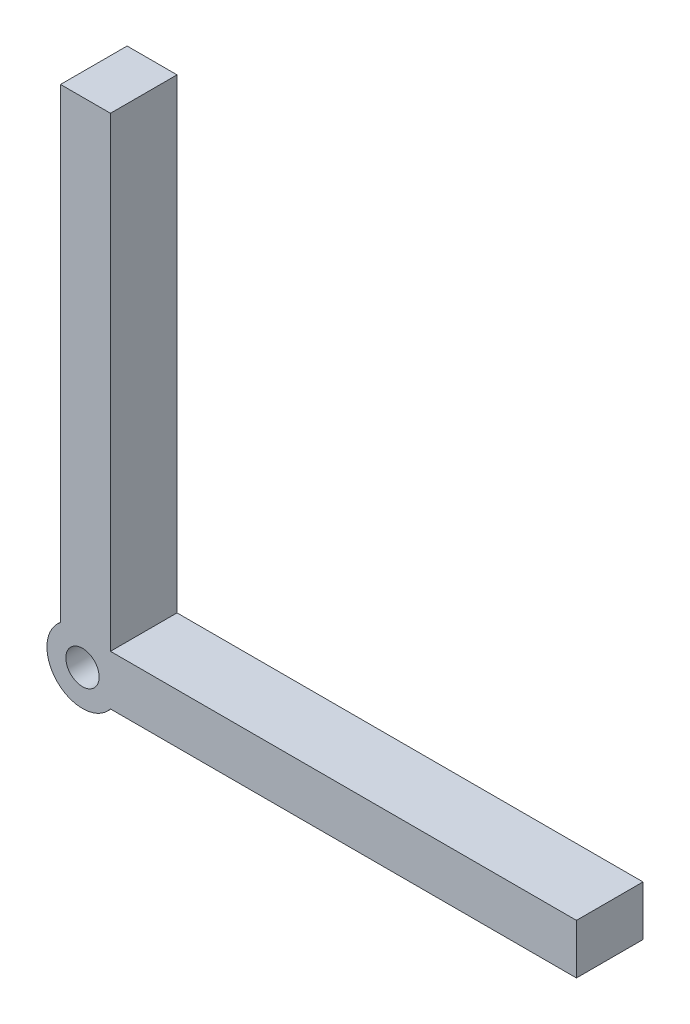
ISO-10303-21;
HEADER;
FILE_DESCRIPTION(('STEP AP214'),'2;1');
FILE_NAME('part.step','',(''),(''),'','','');
FILE_SCHEMA(('AUTOMOTIVE_DESIGN { 1 0 10303 214 1 1 1 1 }'));
ENDSEC;
DATA;
#1=APPLICATION_CONTEXT('core data for automotive mechanical design processes');
#2=APPLICATION_PROTOCOL_DEFINITION('international standard','automotive_design',2000,#1);
#3=PRODUCT_CONTEXT('',#1,'mechanical');
#4=PRODUCT('Part','Part','',(#3));
#5=PRODUCT_RELATED_PRODUCT_CATEGORY('part','',(#4));
#6=PRODUCT_DEFINITION_FORMATION('','',#4);
#7=PRODUCT_DEFINITION_CONTEXT('part definition',#1,'design');
#8=PRODUCT_DEFINITION('design','',#6,#7);
#9=PRODUCT_DEFINITION_SHAPE('','',#8);
#10=(LENGTH_UNIT() NAMED_UNIT(*) SI_UNIT(.MILLI.,.METRE.));
#11=(NAMED_UNIT(*) PLANE_ANGLE_UNIT() SI_UNIT($,.RADIAN.));
#12=(NAMED_UNIT(*) SI_UNIT($,.STERADIAN.) SOLID_ANGLE_UNIT());
#13=UNCERTAINTY_MEASURE_WITH_UNIT(LENGTH_MEASURE(1.E-05),#10,'distance_accuracy_value','');
#14=(GEOMETRIC_REPRESENTATION_CONTEXT(3) GLOBAL_UNCERTAINTY_ASSIGNED_CONTEXT((#13)) GLOBAL_UNIT_ASSIGNED_CONTEXT((#10,
#11,#12)) REPRESENTATION_CONTEXT('',''));
#15=CARTESIAN_POINT('',(0.,0.,0.));
#16=DIRECTION('',(0.,0.,1.));
#17=DIRECTION('',(1.,0.,0.));
#18=AXIS2_PLACEMENT_3D('',#15,#16,#17);
#19=CARTESIAN_POINT('',(-12.7708887360063,0.,10.));
#20=DIRECTION('',(-1.,0.,0.));
#21=DIRECTION('',(0.,0.,1.));
#22=AXIS2_PLACEMENT_3D('',#19,#20,#21);
#23=PLANE('',#22);
#24=DIRECTION('',(0.,1.,0.));
#25=VECTOR('',#24,1.);
#26=CARTESIAN_POINT('',(-12.7708887360063,0.,0.));
#27=LINE('',#26,#25);
#28=CARTESIAN_POINT('',(-12.7708887360063,-21.3494155405741,0.));
#29=VERTEX_POINT('',#28);
#30=CARTESIAN_POINT('',(-12.7708887360063,48.6505844594259,0.));
#31=VERTEX_POINT('',#30);
#32=EDGE_CURVE('E121',#29,#31,#27,.T.);
#33=ORIENTED_EDGE('',*,*,#32,.F.);
#34=DIRECTION('',(0.,0.,-1.));
#35=VECTOR('',#34,1.);
#36=CARTESIAN_POINT('',(-12.7708887360063,-21.3494155405741,10.));
#37=LINE('',#36,#35);
#38=CARTESIAN_POINT('',(-12.7708887360063,-21.3494155405741,10.));
#39=VERTEX_POINT('',#38);
#40=EDGE_CURVE('E11',#39,#29,#37,.T.);
#41=ORIENTED_EDGE('',*,*,#40,.F.);
#42=DIRECTION('',(0.,1.,0.));
#43=VECTOR('',#42,1.);
#44=CARTESIAN_POINT('',(-12.7708887360063,0.,10.));
#45=LINE('',#44,#43);
#46=CARTESIAN_POINT('',(-12.7708887360063,48.6505844594259,10.));
#47=VERTEX_POINT('',#46);
#48=EDGE_CURVE('E139',#39,#47,#45,.T.);
#49=ORIENTED_EDGE('',*,*,#48,.T.);
#50=DIRECTION('',(0.,0.,-1.));
#51=VECTOR('',#50,1.);
#52=CARTESIAN_POINT('',(-12.7708887360063,48.6505844594259,10.));
#53=LINE('',#52,#51);
#54=EDGE_CURVE('E49',#47,#31,#53,.T.);
#55=ORIENTED_EDGE('',*,*,#54,.T.);
#56=EDGE_LOOP('',(#33,#41,#49,#55));
#57=FACE_BOUND('',#56,.T.);
#58=ADVANCED_FACE('F33',(#57),#23,.T.);
#59=CARTESIAN_POINT('',(-9.47340598044089,-25.5519327850087,10.));
#60=DIRECTION('',(0.,0.,-1.));
#61=DIRECTION('',(-1.,0.,0.));
#62=AXIS2_PLACEMENT_3D('',#59,#60,#61);
#63=CYLINDRICAL_SURFACE('',#62,5.34177346140974);
#64=CARTESIAN_POINT('',(-9.47340598044089,-25.5519327850087,0.));
#65=DIRECTION('',(0.,0.,1.));
#66=DIRECTION('',(1.,0.,0.));
#67=AXIS2_PLACEMENT_3D('',#64,#65,#66);
#68=CIRCLE('',#67,5.34177346140974);
#69=CARTESIAN_POINT('',(-5.27088873600629,-28.8494155405741,0.));
#70=VERTEX_POINT('',#69);
#71=EDGE_CURVE('E123',#29,#70,#68,.T.);
#72=ORIENTED_EDGE('',*,*,#71,.T.);
#73=DIRECTION('',(0.,0.,-1.));
#74=VECTOR('',#73,1.);
#75=CARTESIAN_POINT('',(-5.27088873600629,-28.8494155405741,10.));
#76=LINE('',#75,#74);
#77=CARTESIAN_POINT('',(-5.27088873600629,-28.8494155405741,10.));
#78=VERTEX_POINT('',#77);
#79=EDGE_CURVE('E41',#78,#70,#76,.T.);
#80=ORIENTED_EDGE('',*,*,#79,.F.);
#81=CARTESIAN_POINT('',(-9.47340598044089,-25.5519327850087,10.));
#82=DIRECTION('',(0.,0.,1.));
#83=DIRECTION('',(1.,0.,0.));
#84=AXIS2_PLACEMENT_3D('',#81,#82,#83);
#85=CIRCLE('',#84,5.34177346140974);
#86=EDGE_CURVE('E158',#39,#78,#85,.T.);
#87=ORIENTED_EDGE('',*,*,#86,.F.);
#88=ORIENTED_EDGE('',*,*,#40,.T.);
#89=EDGE_LOOP('',(#72,#80,#87,#88));
#90=FACE_BOUND('',#89,.T.);
#91=ADVANCED_FACE('F152',(#90),#63,.T.);
#92=CARTESIAN_POINT('',(0.,-28.8494155405741,10.));
#93=DIRECTION('',(0.,-1.,0.));
#94=DIRECTION('',(1.,0.,0.));
#95=AXIS2_PLACEMENT_3D('',#92,#93,#94);
#96=PLANE('',#95);
#97=DIRECTION('',(-1.,0.,0.));
#98=VECTOR('',#97,1.);
#99=CARTESIAN_POINT('',(0.,-28.8494155405741,0.));
#100=LINE('',#99,#98);
#101=CARTESIAN_POINT('',(64.7291112639937,-28.8494155405741,0.));
#102=VERTEX_POINT('',#101);
#103=EDGE_CURVE('E127',#102,#70,#100,.T.);
#104=ORIENTED_EDGE('',*,*,#103,.F.);
#105=DIRECTION('',(0.,0.,-1.));
#106=VECTOR('',#105,1.);
#107=CARTESIAN_POINT('',(64.7291112639937,-28.8494155405741,10.));
#108=LINE('',#107,#106);
#109=CARTESIAN_POINT('',(64.7291112639937,-28.8494155405741,10.));
#110=VERTEX_POINT('',#109);
#111=EDGE_CURVE('E143',#110,#102,#108,.T.);
#112=ORIENTED_EDGE('',*,*,#111,.F.);
#113=DIRECTION('',(-1.,0.,0.));
#114=VECTOR('',#113,1.);
#115=CARTESIAN_POINT('',(0.,-28.8494155405741,10.));
#116=LINE('',#115,#114);
#117=EDGE_CURVE('E149',#110,#78,#116,.T.);
#118=ORIENTED_EDGE('',*,*,#117,.T.);
#119=ORIENTED_EDGE('',*,*,#79,.T.);
#120=EDGE_LOOP('',(#104,#112,#118,#119));
#121=FACE_BOUND('',#120,.T.);
#122=ADVANCED_FACE('F148',(#121),#96,.T.);
#123=CARTESIAN_POINT('',(64.7291112639937,0.,10.));
#124=DIRECTION('',(1.,0.,0.));
#125=DIRECTION('',(0.,0.,-1.));
#126=AXIS2_PLACEMENT_3D('',#123,#124,#125);
#127=PLANE('',#126);
#128=DIRECTION('',(0.,-1.,0.));
#129=VECTOR('',#128,1.);
#130=CARTESIAN_POINT('',(64.7291112639937,0.,0.));
#131=LINE('',#130,#129);
#132=CARTESIAN_POINT('',(64.7291112639937,-21.3494155405741,0.));
#133=VERTEX_POINT('',#132);
#134=EDGE_CURVE('E130',#133,#102,#131,.T.);
#135=ORIENTED_EDGE('',*,*,#134,.F.);
#136=DIRECTION('',(0.,0.,-1.));
#137=VECTOR('',#136,1.);
#138=CARTESIAN_POINT('',(64.7291112639937,-21.3494155405741,10.));
#139=LINE('',#138,#137);
#140=CARTESIAN_POINT('',(64.7291112639937,-21.3494155405741,10.));
#141=VERTEX_POINT('',#140);
#142=EDGE_CURVE('E102',#141,#133,#139,.T.);
#143=ORIENTED_EDGE('',*,*,#142,.F.);
#144=DIRECTION('',(0.,-1.,0.));
#145=VECTOR('',#144,1.);
#146=CARTESIAN_POINT('',(64.7291112639937,0.,10.));
#147=LINE('',#146,#145);
#148=EDGE_CURVE('E113',#141,#110,#147,.T.);
#149=ORIENTED_EDGE('',*,*,#148,.T.);
#150=ORIENTED_EDGE('',*,*,#111,.T.);
#151=EDGE_LOOP('',(#135,#143,#149,#150));
#152=FACE_BOUND('',#151,.T.);
#153=ADVANCED_FACE('F157',(#152),#127,.T.);
#154=CARTESIAN_POINT('',(0.,-21.3494155405741,10.));
#155=DIRECTION('',(0.,1.,0.));
#156=DIRECTION('',(0.,0.,1.));
#157=AXIS2_PLACEMENT_3D('',#154,#155,#156);
#158=PLANE('',#157);
#159=DIRECTION('',(1.,0.,0.));
#160=VECTOR('',#159,1.);
#161=CARTESIAN_POINT('',(0.,-21.3494155405741,0.));
#162=LINE('',#161,#160);
#163=CARTESIAN_POINT('',(-5.27088873600629,-21.3494155405741,0.));
#164=VERTEX_POINT('',#163);
#165=EDGE_CURVE('E98',#164,#133,#162,.T.);
#166=ORIENTED_EDGE('',*,*,#165,.F.);
#167=DIRECTION('',(0.,0.,-1.));
#168=VECTOR('',#167,1.);
#169=CARTESIAN_POINT('',(-5.27088873600629,-21.3494155405741,10.));
#170=LINE('',#169,#168);
#171=CARTESIAN_POINT('',(-5.27088873600629,-21.3494155405741,10.));
#172=VERTEX_POINT('',#171);
#173=EDGE_CURVE('E93',#172,#164,#170,.T.);
#174=ORIENTED_EDGE('',*,*,#173,.F.);
#175=DIRECTION('',(1.,0.,0.));
#176=VECTOR('',#175,1.);
#177=CARTESIAN_POINT('',(0.,-21.3494155405741,10.));
#178=LINE('',#177,#176);
#179=EDGE_CURVE('E96',#172,#141,#178,.T.);
#180=ORIENTED_EDGE('',*,*,#179,.T.);
#181=ORIENTED_EDGE('',*,*,#142,.T.);
#182=EDGE_LOOP('',(#166,#174,#180,#181));
#183=FACE_BOUND('',#182,.T.);
#184=ADVANCED_FACE('F95',(#183),#158,.T.);
#185=CARTESIAN_POINT('',(-5.27088873600629,0.,10.));
#186=DIRECTION('',(1.,0.,0.));
#187=DIRECTION('',(0.,1.,0.));
#188=AXIS2_PLACEMENT_3D('',#185,#186,#187);
#189=PLANE('',#188);
#190=DIRECTION('',(0.,-1.,0.));
#191=VECTOR('',#190,1.);
#192=CARTESIAN_POINT('',(-5.27088873600629,0.,0.));
#193=LINE('',#192,#191);
#194=CARTESIAN_POINT('',(-5.2708887360063,48.6505844594259,0.));
#195=VERTEX_POINT('',#194);
#196=EDGE_CURVE('E134',#195,#164,#193,.T.);
#197=ORIENTED_EDGE('',*,*,#196,.F.);
#198=DIRECTION('',(0.,0.,-1.));
#199=VECTOR('',#198,1.);
#200=CARTESIAN_POINT('',(-5.2708887360063,48.6505844594259,10.));
#201=LINE('',#200,#199);
#202=CARTESIAN_POINT('',(-5.2708887360063,48.6505844594259,10.));
#203=VERTEX_POINT('',#202);
#204=EDGE_CURVE('E71',#203,#195,#201,.T.);
#205=ORIENTED_EDGE('',*,*,#204,.F.);
#206=DIRECTION('',(0.,-1.,0.));
#207=VECTOR('',#206,1.);
#208=CARTESIAN_POINT('',(-5.27088873600629,0.,10.));
#209=LINE('',#208,#207);
#210=EDGE_CURVE('E110',#203,#172,#209,.T.);
#211=ORIENTED_EDGE('',*,*,#210,.T.);
#212=ORIENTED_EDGE('',*,*,#173,.T.);
#213=EDGE_LOOP('',(#197,#205,#211,#212));
#214=FACE_BOUND('',#213,.T.);
#215=ADVANCED_FACE('F115',(#214),#189,.T.);
#216=CARTESIAN_POINT('',(0.,48.6505844594259,10.));
#217=DIRECTION('',(0.,1.,0.));
#218=DIRECTION('',(0.,0.,1.));
#219=AXIS2_PLACEMENT_3D('',#216,#217,#218);
#220=PLANE('',#219);
#221=DIRECTION('',(1.,0.,0.));
#222=VECTOR('',#221,1.);
#223=CARTESIAN_POINT('',(0.,48.6505844594259,0.));
#224=LINE('',#223,#222);
#225=EDGE_CURVE('E136',#31,#195,#224,.T.);
#226=ORIENTED_EDGE('',*,*,#225,.F.);
#227=ORIENTED_EDGE('',*,*,#54,.F.);
#228=DIRECTION('',(1.,0.,0.));
#229=VECTOR('',#228,1.);
#230=CARTESIAN_POINT('',(0.,48.6505844594259,10.));
#231=LINE('',#230,#229);
#232=EDGE_CURVE('E116',#47,#203,#231,.T.);
#233=ORIENTED_EDGE('',*,*,#232,.T.);
#234=ORIENTED_EDGE('',*,*,#204,.T.);
#235=EDGE_LOOP('',(#226,#227,#233,#234));
#236=FACE_BOUND('',#235,.T.);
#237=ADVANCED_FACE('F181',(#236),#220,.T.);
#238=CARTESIAN_POINT('',(0.,0.,10.));
#239=DIRECTION('',(0.,0.,1.));
#240=DIRECTION('',(1.,0.,0.));
#241=AXIS2_PLACEMENT_3D('',#238,#239,#240);
#242=PLANE('',#241);
#243=CARTESIAN_POINT('',(-9.47340598044089,-25.5519327850087,10.));
#244=DIRECTION('',(0.,0.,-1.));
#245=DIRECTION('',(-1.,0.,0.));
#246=AXIS2_PLACEMENT_3D('',#243,#244,#245);
#247=CIRCLE('',#246,2.5);
#248=CARTESIAN_POINT('',(-11.9734059804409,-25.5519327850087,10.));
#249=VERTEX_POINT('',#248);
#250=EDGE_CURVE('E124',#249,#249,#247,.T.);
#251=ORIENTED_EDGE('',*,*,#250,.T.);
#252=EDGE_LOOP('',(#251));
#253=FACE_BOUND('',#252,.T.);
#254=ORIENTED_EDGE('',*,*,#48,.F.);
#255=ORIENTED_EDGE('',*,*,#86,.T.);
#256=ORIENTED_EDGE('',*,*,#117,.F.);
#257=ORIENTED_EDGE('',*,*,#148,.F.);
#258=ORIENTED_EDGE('',*,*,#179,.F.);
#259=ORIENTED_EDGE('',*,*,#210,.F.);
#260=ORIENTED_EDGE('',*,*,#232,.F.);
#261=EDGE_LOOP('',(#254,#255,#256,#257,#258,#259,#260));
#262=FACE_BOUND('',#261,.T.);
#263=ADVANCED_FACE('F108',(#253,#262),#242,.T.);
#264=CARTESIAN_POINT('',(0.,0.,0.));
#265=DIRECTION('',(0.,0.,1.));
#266=DIRECTION('',(1.,0.,0.));
#267=AXIS2_PLACEMENT_3D('',#264,#265,#266);
#268=PLANE('',#267);
#269=CARTESIAN_POINT('',(-9.47340598044089,-25.5519327850087,0.));
#270=DIRECTION('',(0.,0.,-1.));
#271=DIRECTION('',(-1.,0.,0.));
#272=AXIS2_PLACEMENT_3D('',#269,#270,#271);
#273=CIRCLE('',#272,2.5);
#274=CARTESIAN_POINT('',(-11.9734059804409,-25.5519327850087,0.));
#275=VERTEX_POINT('',#274);
#276=EDGE_CURVE('E163',#275,#275,#273,.T.);
#277=ORIENTED_EDGE('',*,*,#276,.F.);
#278=EDGE_LOOP('',(#277));
#279=FACE_BOUND('',#278,.T.);
#280=ORIENTED_EDGE('',*,*,#32,.T.);
#281=ORIENTED_EDGE('',*,*,#225,.T.);
#282=ORIENTED_EDGE('',*,*,#196,.T.);
#283=ORIENTED_EDGE('',*,*,#165,.T.);
#284=ORIENTED_EDGE('',*,*,#134,.T.);
#285=ORIENTED_EDGE('',*,*,#103,.T.);
#286=ORIENTED_EDGE('',*,*,#71,.F.);
#287=EDGE_LOOP('',(#280,#281,#282,#283,#284,#285,#286));
#288=FACE_BOUND('',#287,.T.);
#289=ADVANCED_FACE('F154',(#279,#288),#268,.F.);
#290=CARTESIAN_POINT('',(-9.47340598044089,-25.5519327850087,10.));
#291=DIRECTION('',(0.,0.,-1.));
#292=DIRECTION('',(-1.,0.,0.));
#293=AXIS2_PLACEMENT_3D('',#290,#291,#292);
#294=CYLINDRICAL_SURFACE('',#293,2.5);
#295=ORIENTED_EDGE('',*,*,#250,.F.);
#296=EDGE_LOOP('',(#295));
#297=FACE_BOUND('',#296,.T.);
#298=ORIENTED_EDGE('',*,*,#276,.T.);
#299=EDGE_LOOP('',(#298));
#300=FACE_BOUND('',#299,.T.);
#301=ADVANCED_FACE('F170',(#297,#300),#294,.F.);
#302=CLOSED_SHELL('',(#58,#91,#122,#153,#184,#215,#237,#263,#289,#301));
#303=MANIFOLD_SOLID_BREP('B2',#302);
#304=ADVANCED_BREP_SHAPE_REPRESENTATION('',(#18,#303),#14);
#305=SHAPE_DEFINITION_REPRESENTATION(#9,#304);
ENDSEC;
END-ISO-10303-21;
